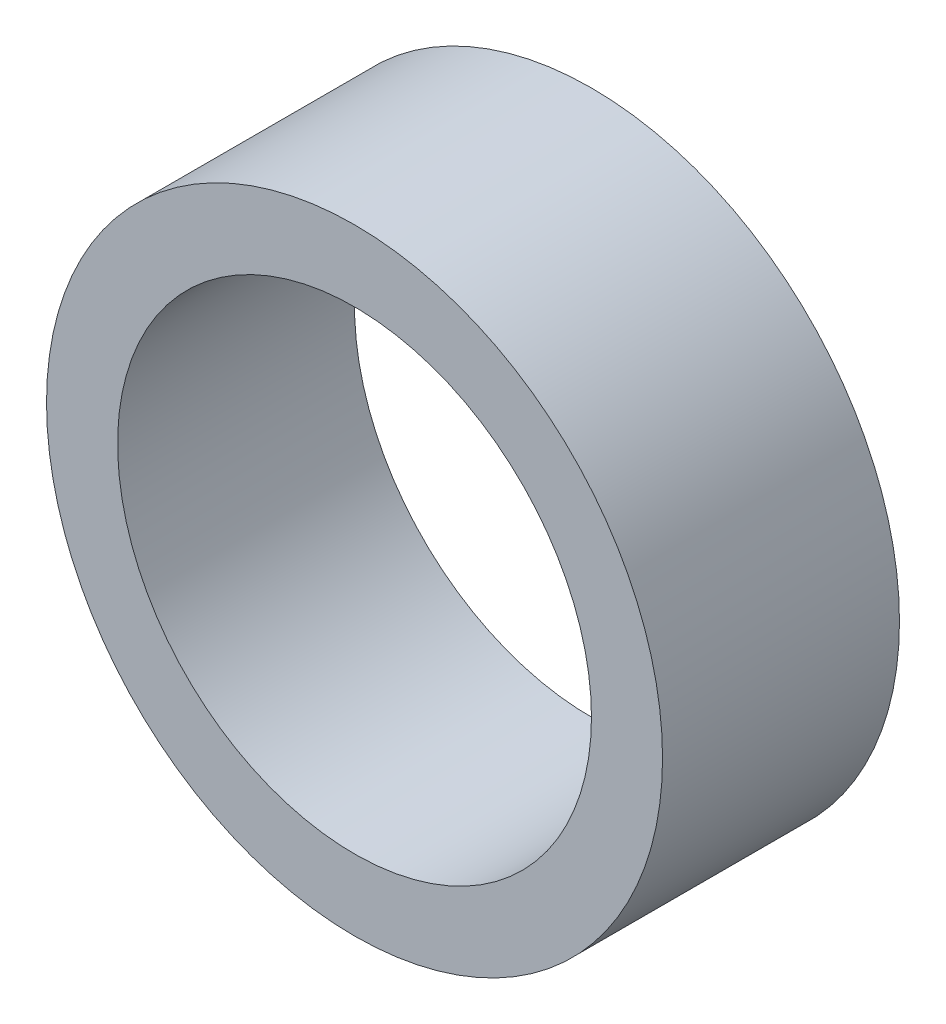
ISO-10303-21;
HEADER;
FILE_DESCRIPTION(('STEP AP214'),'2;1');
FILE_NAME('part.step','',(''),(''),'','','');
FILE_SCHEMA(('AUTOMOTIVE_DESIGN { 1 0 10303 214 1 1 1 1 }'));
ENDSEC;
DATA;
#1=APPLICATION_CONTEXT('core data for automotive mechanical design processes');
#2=APPLICATION_PROTOCOL_DEFINITION('international standard','automotive_design',2000,#1);
#3=PRODUCT_CONTEXT('',#1,'mechanical');
#4=PRODUCT('Part','Part','',(#3));
#5=PRODUCT_RELATED_PRODUCT_CATEGORY('part','',(#4));
#6=PRODUCT_DEFINITION_FORMATION('','',#4);
#7=PRODUCT_DEFINITION_CONTEXT('part definition',#1,'design');
#8=PRODUCT_DEFINITION('design','',#6,#7);
#9=PRODUCT_DEFINITION_SHAPE('','',#8);
#10=(LENGTH_UNIT() NAMED_UNIT(*) SI_UNIT(.MILLI.,.METRE.));
#11=(NAMED_UNIT(*) PLANE_ANGLE_UNIT() SI_UNIT($,.RADIAN.));
#12=(NAMED_UNIT(*) SI_UNIT($,.STERADIAN.) SOLID_ANGLE_UNIT());
#13=UNCERTAINTY_MEASURE_WITH_UNIT(LENGTH_MEASURE(1.E-05),#10,'distance_accuracy_value','');
#14=(GEOMETRIC_REPRESENTATION_CONTEXT(3) GLOBAL_UNCERTAINTY_ASSIGNED_CONTEXT((#13)) GLOBAL_UNIT_ASSIGNED_CONTEXT((#10,
#11,#12)) REPRESENTATION_CONTEXT('',''));
#15=CARTESIAN_POINT('',(0.,0.,0.));
#16=DIRECTION('',(0.,0.,1.));
#17=DIRECTION('',(1.,0.,0.));
#18=AXIS2_PLACEMENT_3D('',#15,#16,#17);
#19=CARTESIAN_POINT('',(0.,0.,5.));
#20=DIRECTION('',(0.,0.,1.));
#21=DIRECTION('',(1.,0.,0.));
#22=AXIS2_PLACEMENT_3D('',#19,#20,#21);
#23=PLANE('',#22);
#24=CARTESIAN_POINT('',(0.,0.,5.));
#25=DIRECTION('',(0.,0.,1.));
#26=DIRECTION('',(1.,0.,0.));
#27=AXIS2_PLACEMENT_3D('',#24,#25,#26);
#28=CIRCLE('',#27,6.5);
#29=CARTESIAN_POINT('',(6.5,0.,5.));
#30=VERTEX_POINT('',#29);
#31=EDGE_CURVE('E10',#30,#30,#28,.T.);
#32=ORIENTED_EDGE('',*,*,#31,.T.);
#33=EDGE_LOOP('',(#32));
#34=FACE_BOUND('',#33,.T.);
#35=CARTESIAN_POINT('',(0.,0.,5.));
#36=DIRECTION('',(0.,0.,1.));
#37=DIRECTION('',(1.,0.,0.));
#38=AXIS2_PLACEMENT_3D('',#35,#36,#37);
#39=CIRCLE('',#38,5.);
#40=CARTESIAN_POINT('',(5.,0.,5.));
#41=VERTEX_POINT('',#40);
#42=EDGE_CURVE('E46',#41,#41,#39,.T.);
#43=ORIENTED_EDGE('',*,*,#42,.F.);
#44=EDGE_LOOP('',(#43));
#45=FACE_BOUND('',#44,.T.);
#46=ADVANCED_FACE('F35',(#34,#45),#23,.T.);
#47=CARTESIAN_POINT('',(0.,0.,0.));
#48=DIRECTION('',(0.,0.,1.));
#49=DIRECTION('',(1.,0.,0.));
#50=AXIS2_PLACEMENT_3D('',#47,#48,#49);
#51=PLANE('',#50);
#52=CARTESIAN_POINT('',(0.,0.,0.));
#53=DIRECTION('',(0.,0.,1.));
#54=DIRECTION('',(1.,0.,0.));
#55=AXIS2_PLACEMENT_3D('',#52,#53,#54);
#56=CIRCLE('',#55,6.5);
#57=CARTESIAN_POINT('',(6.5,0.,0.));
#58=VERTEX_POINT('',#57);
#59=EDGE_CURVE('E39',#58,#58,#56,.T.);
#60=ORIENTED_EDGE('',*,*,#59,.F.);
#61=EDGE_LOOP('',(#60));
#62=FACE_BOUND('',#61,.T.);
#63=CARTESIAN_POINT('',(0.,0.,0.));
#64=DIRECTION('',(0.,0.,1.));
#65=DIRECTION('',(1.,0.,0.));
#66=AXIS2_PLACEMENT_3D('',#63,#64,#65);
#67=CIRCLE('',#66,5.);
#68=CARTESIAN_POINT('',(5.,0.,0.));
#69=VERTEX_POINT('',#68);
#70=EDGE_CURVE('E48',#69,#69,#67,.T.);
#71=ORIENTED_EDGE('',*,*,#70,.T.);
#72=EDGE_LOOP('',(#71));
#73=FACE_BOUND('',#72,.T.);
#74=ADVANCED_FACE('F58',(#62,#73),#51,.F.);
#75=CARTESIAN_POINT('',(0.,0.,5.));
#76=DIRECTION('',(0.,0.,-1.));
#77=DIRECTION('',(-1.,0.,0.));
#78=AXIS2_PLACEMENT_3D('',#75,#76,#77);
#79=CYLINDRICAL_SURFACE('',#78,6.5);
#80=ORIENTED_EDGE('',*,*,#31,.F.);
#81=EDGE_LOOP('',(#80));
#82=FACE_BOUND('',#81,.T.);
#83=ORIENTED_EDGE('',*,*,#59,.T.);
#84=EDGE_LOOP('',(#83));
#85=FACE_BOUND('',#84,.T.);
#86=ADVANCED_FACE('F37',(#82,#85),#79,.T.);
#87=CARTESIAN_POINT('',(0.,0.,5.));
#88=DIRECTION('',(0.,0.,-1.));
#89=DIRECTION('',(-1.,0.,0.));
#90=AXIS2_PLACEMENT_3D('',#87,#88,#89);
#91=CYLINDRICAL_SURFACE('',#90,5.);
#92=ORIENTED_EDGE('',*,*,#42,.T.);
#93=EDGE_LOOP('',(#92));
#94=FACE_BOUND('',#93,.T.);
#95=ORIENTED_EDGE('',*,*,#70,.F.);
#96=EDGE_LOOP('',(#95));
#97=FACE_BOUND('',#96,.T.);
#98=ADVANCED_FACE('F54',(#94,#97),#91,.F.);
#99=CLOSED_SHELL('',(#46,#74,#86,#98));
#100=MANIFOLD_SOLID_BREP('B2',#99);
#101=ADVANCED_BREP_SHAPE_REPRESENTATION('',(#18,#100),#14);
#102=SHAPE_DEFINITION_REPRESENTATION(#9,#101);
ENDSEC;
END-ISO-10303-21;
